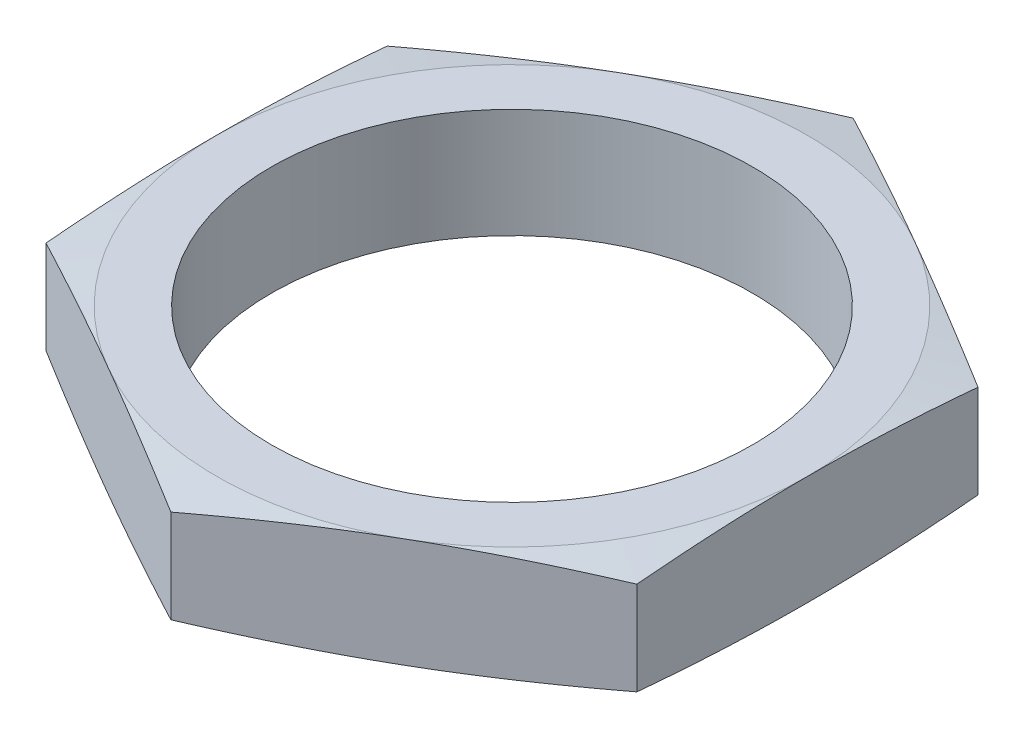
ISO-10303-21;
HEADER;
FILE_DESCRIPTION(('STEP AP214'),'2;1');
FILE_NAME('part.step','',(''),(''),'','','');
FILE_SCHEMA(('AUTOMOTIVE_DESIGN { 1 0 10303 214 1 1 1 1 }'));
ENDSEC;
DATA;
#1=APPLICATION_CONTEXT('core data for automotive mechanical design processes');
#2=APPLICATION_PROTOCOL_DEFINITION('international standard','automotive_design',2000,#1);
#3=PRODUCT_CONTEXT('',#1,'mechanical');
#4=PRODUCT('Part','Part','',(#3));
#5=PRODUCT_RELATED_PRODUCT_CATEGORY('part','',(#4));
#6=PRODUCT_DEFINITION_FORMATION('','',#4);
#7=PRODUCT_DEFINITION_CONTEXT('part definition',#1,'design');
#8=PRODUCT_DEFINITION('design','',#6,#7);
#9=PRODUCT_DEFINITION_SHAPE('','',#8);
#10=(LENGTH_UNIT() NAMED_UNIT(*) SI_UNIT(.MILLI.,.METRE.));
#11=(NAMED_UNIT(*) PLANE_ANGLE_UNIT() SI_UNIT($,.RADIAN.));
#12=(NAMED_UNIT(*) SI_UNIT($,.STERADIAN.) SOLID_ANGLE_UNIT());
#13=UNCERTAINTY_MEASURE_WITH_UNIT(LENGTH_MEASURE(1.E-05),#10,'distance_accuracy_value','');
#14=(GEOMETRIC_REPRESENTATION_CONTEXT(3) GLOBAL_UNCERTAINTY_ASSIGNED_CONTEXT((#13)) GLOBAL_UNIT_ASSIGNED_CONTEXT((#10,
#11,#12)) REPRESENTATION_CONTEXT('',''));
#15=CARTESIAN_POINT('',(0.,0.,0.));
#16=DIRECTION('',(0.,0.,1.));
#17=DIRECTION('',(1.,0.,0.));
#18=AXIS2_PLACEMENT_3D('',#15,#16,#17);
#19=CARTESIAN_POINT('',(13.5,5.,-7.79422863405995));
#20=DIRECTION('',(-0.5,0.,0.866025403784439));
#21=DIRECTION('',(0.866025403784439,0.,0.5));
#22=AXIS2_PLACEMENT_3D('',#19,#20,#21);
#23=PLANE('',#22);
#24=CARTESIAN_POINT('',(-0.00020000000000303,0.368271725138405,-15.5885727381737));
#25=CARTESIAN_POINT('',(0.561497951332436,0.31106498335108,-15.2642762747687));
#26=CARTESIAN_POINT('',(1.12364119894401,0.259202355278571,-14.939722719437));
#27=CARTESIAN_POINT('',(2.24878862374861,0.168169684781309,-14.2901185508481));
#28=CARTESIAN_POINT('',(2.81179293139074,0.129001807993039,-13.965067862276));
#29=CARTESIAN_POINT('',(3.93717630447165,0.0654553024233978,-13.3153274688862));
#30=CARTESIAN_POINT('',(4.49955393528797,0.0410436635396148,-12.9906385923481));
#31=CARTESIAN_POINT('',(5.62462106334258,0.00831666332102138,-12.3410807831094));
#32=CARTESIAN_POINT('',(6.18731053167129,0.,-12.0162118670997));
#33=CARTESIAN_POINT('',(7.3126894683287,0.,-11.3664740350802));
#34=CARTESIAN_POINT('',(7.87537893665741,0.00831666332102166,-11.0416051190704));
#35=CARTESIAN_POINT('',(9.00044606471202,0.041043663539615,-10.3920473098317));
#36=CARTESIAN_POINT('',(9.56282369552834,0.0654553024233979,-10.0673584332937));
#37=CARTESIAN_POINT('',(10.6882070686092,0.129001807993039,-9.41761803990388));
#38=CARTESIAN_POINT('',(11.2512113762514,0.168169684781309,-9.09256735133178));
#39=CARTESIAN_POINT('',(12.376358801056,0.259202355278571,-8.44296318274283));
#40=CARTESIAN_POINT('',(12.9385020486676,0.31106498335108,-8.11840962741116));
#41=CARTESIAN_POINT('',(13.5002,0.368271725138405,-7.79411316400611));
#42=B_SPLINE_CURVE_WITH_KNOTS('',3,(#24,#25,#26,#27,#28,#29,#30,#31,#32,#33,#34,#35,#36,#37,#38,
#39,#40,#41),.UNSPECIFIED.,.F.,.F.,(4,2,2,2,2,2,2,2,4),(0.,1.95337491286409,3.9070828827549,
5.85640402319247,7.80556746874311,9.75473091429375,11.7040520547313,13.6577600246221,
15.6111349374862),.UNSPECIFIED.);
#43=CARTESIAN_POINT('',(0.,0.368251364426223,-15.5884572681199));
#44=VERTEX_POINT('',#43);
#45=CARTESIAN_POINT('',(6.75,0.,-11.6913429510899));
#46=VERTEX_POINT('',#45);
#47=EDGE_CURVE('E55',#44,#46,#42,.T.);
#48=ORIENTED_EDGE('',*,*,#47,.F.);
#49=DIRECTION('',(0.,-1.,0.));
#50=VECTOR('',#49,1.);
#51=CARTESIAN_POINT('',(0.,5.,-15.5884572681199));
#52=LINE('',#51,#50);
#53=CARTESIAN_POINT('',(0.,4.63174863557378,-15.5884572681199));
#54=VERTEX_POINT('',#53);
#55=EDGE_CURVE('E281',#54,#44,#52,.T.);
#56=ORIENTED_EDGE('',*,*,#55,.F.);
#57=CARTESIAN_POINT('',(13.5002,4.6317282748616,-7.79411316400611));
#58=CARTESIAN_POINT('',(12.9385020486676,4.68893501664892,-8.11840962741116));
#59=CARTESIAN_POINT('',(12.376358801056,4.74079764472143,-8.44296318274283));
#60=CARTESIAN_POINT('',(11.2512113762514,4.83183031521869,-9.09256735133178));
#61=CARTESIAN_POINT('',(10.6882070686093,4.87099819200696,-9.41761803990388));
#62=CARTESIAN_POINT('',(9.56282369552834,4.9345446975766,-10.0673584332937));
#63=CARTESIAN_POINT('',(9.00044606471202,4.95895633646039,-10.3920473098317));
#64=CARTESIAN_POINT('',(7.87537893665742,4.99168333667898,-11.0416051190704));
#65=CARTESIAN_POINT('',(7.31268946832871,5.,-11.3664740350802));
#66=CARTESIAN_POINT('',(6.18731053167129,5.,-12.0162118670997));
#67=CARTESIAN_POINT('',(5.62462106334258,4.99168333667898,-12.3410807831094));
#68=CARTESIAN_POINT('',(4.49955393528797,4.95895633646039,-12.9906385923481));
#69=CARTESIAN_POINT('',(3.93717630447165,4.9345446975766,-13.3153274688862));
#70=CARTESIAN_POINT('',(2.81179293139074,4.87099819200696,-13.965067862276));
#71=CARTESIAN_POINT('',(2.24878862374861,4.83183031521869,-14.2901185508481));
#72=CARTESIAN_POINT('',(1.12364119894401,4.74079764472143,-14.939722719437));
#73=CARTESIAN_POINT('',(0.561497951332437,4.68893501664892,-15.2642762747687));
#74=CARTESIAN_POINT('',(-0.000200000000000708,4.6317282748616,-15.5885727381737));
#75=B_SPLINE_CURVE_WITH_KNOTS('',3,(#57,#58,#59,#60,#61,#62,#63,#64,#65,#66,#67,#68,#69,#70,#71,
#72,#73,#74),.UNSPECIFIED.,.F.,.F.,(4,2,2,2,2,2,2,2,4),(0.,1.95337491286409,3.9070828827549,
5.85640402319247,7.80556746874311,9.75473091429375,11.7040520547313,13.6577600246221,
15.6111349374862),.UNSPECIFIED.);
#76=CARTESIAN_POINT('',(6.75,5.,-11.6913429510899));
#77=VERTEX_POINT('',#76);
#78=EDGE_CURVE('E253',#77,#54,#75,.T.);
#79=ORIENTED_EDGE('',*,*,#78,.F.);
#80=CARTESIAN_POINT('',(13.5,4.63174863557382,-7.79422863405996));
#81=VERTEX_POINT('',#80);
#82=EDGE_CURVE('E321',#81,#77,#75,.T.);
#83=ORIENTED_EDGE('',*,*,#82,.F.);
#84=DIRECTION('',(0.,-1.,0.));
#85=VECTOR('',#84,1.);
#86=CARTESIAN_POINT('',(13.5,5.,-7.79422863405995));
#87=LINE('',#86,#85);
#88=CARTESIAN_POINT('',(13.5,0.368251364426223,-7.79422863405995));
#89=VERTEX_POINT('',#88);
#90=EDGE_CURVE('E323',#81,#89,#87,.T.);
#91=ORIENTED_EDGE('',*,*,#90,.T.);
#92=EDGE_CURVE('E140',#46,#89,#42,.T.);
#93=ORIENTED_EDGE('',*,*,#92,.F.);
#94=EDGE_LOOP('',(#48,#56,#79,#83,#91,#93));
#95=FACE_BOUND('',#94,.T.);
#96=ADVANCED_FACE('F39',(#95),#23,.F.);
#97=CARTESIAN_POINT('',(0.,5.,-15.5884572681199));
#98=DIRECTION('',(0.5,0.,0.866025403784439));
#99=DIRECTION('',(0.866025403784439,0.,-0.5));
#100=AXIS2_PLACEMENT_3D('',#97,#98,#99);
#101=PLANE('',#100);
#102=CARTESIAN_POINT('',(-13.5002,0.368271725138405,-7.79411316400611));
#103=CARTESIAN_POINT('',(-12.9385020486676,0.311064983351081,-8.11840962741115));
#104=CARTESIAN_POINT('',(-12.376358801056,0.259202355278572,-8.44296318274282));
#105=CARTESIAN_POINT('',(-11.2512113762514,0.168169684781309,-9.09256735133177));
#106=CARTESIAN_POINT('',(-10.6882070686093,0.12900180799304,-9.41761803990388));
#107=CARTESIAN_POINT('',(-9.56282369552835,0.0654553024233985,-10.0673584332937));
#108=CARTESIAN_POINT('',(-9.00044606471203,0.0410436635396154,-10.3920473098317));
#109=CARTESIAN_POINT('',(-7.87537893665742,0.00831666332102167,-11.0416051190704));
#110=CARTESIAN_POINT('',(-7.31268946832871,0.,-11.3664740350802));
#111=CARTESIAN_POINT('',(-6.18731053167129,0.,-12.0162118670997));
#112=CARTESIAN_POINT('',(-5.62462106334258,0.00831666332102172,-12.3410807831094));
#113=CARTESIAN_POINT('',(-4.49955393528798,0.0410436635396152,-12.9906385923481));
#114=CARTESIAN_POINT('',(-3.93717630447166,0.065455302423398,-13.3153274688862));
#115=CARTESIAN_POINT('',(-2.81179293139075,0.129001807993039,-13.965067862276));
#116=CARTESIAN_POINT('',(-2.24878862374861,0.168169684781309,-14.2901185508481));
#117=CARTESIAN_POINT('',(-1.12364119894401,0.259202355278571,-14.939722719437));
#118=CARTESIAN_POINT('',(-0.56149795133244,0.311064983351081,-15.2642762747687));
#119=CARTESIAN_POINT('',(0.000199999999997351,0.368271725138404,-15.5885727381737));
#120=B_SPLINE_CURVE_WITH_KNOTS('',3,(#102,#103,#104,#105,#106,#107,#108,#109,#110,#111,#112,
#113,#114,#115,#116,#117,#118,#119),.UNSPECIFIED.,.F.,.F.,(4,2,2,2,2,2,2,2,4),(0.,
1.95337491286409,3.9070828827549,5.85640402319247,7.80556746874311,9.75473091429376,
11.7040520547313,13.6577600246221,15.6111349374862),.UNSPECIFIED.);
#121=CARTESIAN_POINT('',(-13.5,0.368251364426224,-7.79422863405994));
#122=VERTEX_POINT('',#121);
#123=CARTESIAN_POINT('',(-6.75,0.,-11.6913429510899));
#124=VERTEX_POINT('',#123);
#125=EDGE_CURVE('E63',#122,#124,#120,.T.);
#126=ORIENTED_EDGE('',*,*,#125,.F.);
#127=DIRECTION('',(0.,-1.,0.));
#128=VECTOR('',#127,1.);
#129=CARTESIAN_POINT('',(-13.5,5.,-7.79422863405994));
#130=LINE('',#129,#128);
#131=CARTESIAN_POINT('',(-13.5,4.63174863557378,-7.79422863405994));
#132=VERTEX_POINT('',#131);
#133=EDGE_CURVE('E274',#132,#122,#130,.T.);
#134=ORIENTED_EDGE('',*,*,#133,.F.);
#135=CARTESIAN_POINT('',(0.000199999999996603,4.6317282748616,-15.5885727381737));
#136=CARTESIAN_POINT('',(-0.561497951332441,4.68893501664892,-15.2642762747687));
#137=CARTESIAN_POINT('',(-1.12364119894401,4.74079764472143,-14.939722719437));
#138=CARTESIAN_POINT('',(-2.24878862374861,4.83183031521869,-14.2901185508481));
#139=CARTESIAN_POINT('',(-2.81179293139075,4.87099819200696,-13.965067862276));
#140=CARTESIAN_POINT('',(-3.93717630447166,4.9345446975766,-13.3153274688862));
#141=CARTESIAN_POINT('',(-4.49955393528798,4.95895633646039,-12.9906385923481));
#142=CARTESIAN_POINT('',(-5.62462106334258,4.99168333667898,-12.3410807831094));
#143=CARTESIAN_POINT('',(-6.18731053167129,5.,-12.0162118670997));
#144=CARTESIAN_POINT('',(-7.31268946832871,5.,-11.3664740350802));
#145=CARTESIAN_POINT('',(-7.87537893665742,4.99168333667898,-11.0416051190704));
#146=CARTESIAN_POINT('',(-9.00044606471203,4.95895633646038,-10.3920473098317));
#147=CARTESIAN_POINT('',(-9.56282369552835,4.9345446975766,-10.0673584332937));
#148=CARTESIAN_POINT('',(-10.6882070686093,4.87099819200696,-9.41761803990388));
#149=CARTESIAN_POINT('',(-11.2512113762514,4.83183031521869,-9.09256735133177));
#150=CARTESIAN_POINT('',(-12.376358801056,4.74079764472143,-8.44296318274282));
#151=CARTESIAN_POINT('',(-12.9385020486676,4.68893501664892,-8.11840962741115));
#152=CARTESIAN_POINT('',(-13.5002,4.63172827486159,-7.79411316400611));
#153=B_SPLINE_CURVE_WITH_KNOTS('',3,(#135,#136,#137,#138,#139,#140,#141,#142,#143,#144,#145,
#146,#147,#148,#149,#150,#151,#152),.UNSPECIFIED.,.F.,.F.,(4,2,2,2,2,2,2,2,4),(0.,
1.95337491286409,3.9070828827549,5.85640402319247,7.80556746874311,9.75473091429376,
11.7040520547313,13.6577600246221,15.6111349374862),.UNSPECIFIED.);
#154=CARTESIAN_POINT('',(-6.75,5.,-11.6913429510899));
#155=VERTEX_POINT('',#154);
#156=EDGE_CURVE('E246',#155,#132,#153,.T.);
#157=ORIENTED_EDGE('',*,*,#156,.F.);
#158=EDGE_CURVE('E252',#54,#155,#153,.T.);
#159=ORIENTED_EDGE('',*,*,#158,.F.);
#160=ORIENTED_EDGE('',*,*,#55,.T.);
#161=EDGE_CURVE('E163',#124,#44,#120,.T.);
#162=ORIENTED_EDGE('',*,*,#161,.F.);
#163=EDGE_LOOP('',(#126,#134,#157,#159,#160,#162));
#164=FACE_BOUND('',#163,.T.);
#165=ADVANCED_FACE('F259',(#164),#101,.F.);
#166=CARTESIAN_POINT('',(-13.5,5.,-7.79422863405994));
#167=DIRECTION('',(1.,0.,0.));
#168=DIRECTION('',(0.,0.,-1.));
#169=AXIS2_PLACEMENT_3D('',#166,#167,#168);
#170=PLANE('',#169);
#171=CARTESIAN_POINT('',(-13.5,2.50038445985799,24.1651341778048));
#172=CARTESIAN_POINT('',(-13.5,2.41133438586779,23.5865655697409));
#173=CARTESIAN_POINT('',(-13.5,2.3230055622341,23.0078848992821));
#174=CARTESIAN_POINT('',(-13.5,2.14811279405614,21.8502530795387));
#175=CARTESIAN_POINT('',(-13.5,2.06154886147534,21.2713019284477));
#176=CARTESIAN_POINT('',(-13.5,1.89050294751876,20.1130464697946));
#177=CARTESIAN_POINT('',(-13.5,1.80602112541964,19.5337421386672));
#178=CARTESIAN_POINT('',(-13.5,1.6395670803526,18.3747732059946));
#179=CARTESIAN_POINT('',(-13.5,1.55759485394562,17.7951086049442));
#180=CARTESIAN_POINT('',(-13.5,1.39633127331956,16.6328657618726));
#181=CARTESIAN_POINT('',(-13.5,1.31705295770941,16.0502857062533));
#182=CARTESIAN_POINT('',(-13.5,1.1622023727252,14.884633606531));
#183=CARTESIAN_POINT('',(-13.5,1.08663009151501,14.3015615640053));
#184=CARTESIAN_POINT('',(-13.5,0.93999668772585,13.1348203987256));
#185=CARTESIAN_POINT('',(-13.5,0.868935777041812,12.5511512492324));
#186=CARTESIAN_POINT('',(-13.5,0.732321153654732,11.3831651415254));
#187=CARTESIAN_POINT('',(-13.5,0.666767442345757,10.7988481831476));
#188=CARTESIAN_POINT('',(-13.5,0.543127517647167,9.63670252981086));
#189=CARTESIAN_POINT('',(-13.5,0.484959227429369,9.05888262518919));
#190=CARTESIAN_POINT('',(-13.5,0.376495408899913,7.90249784506874));
#191=CARTESIAN_POINT('',(-13.5,0.326199881744173,7.32393296946059));
#192=CARTESIAN_POINT('',(-13.5,0.234955033257652,6.16611352907483));
#193=CARTESIAN_POINT('',(-13.5,0.194004831218052,5.58685903446343));
#194=CARTESIAN_POINT('',(-13.5,0.122928088159684,4.42768852092813));
#195=CARTESIAN_POINT('',(-13.5,0.0928013420662188,3.84777251474693));
#196=CARTESIAN_POINT('',(-13.5,0.0447201045273418,2.68859630675632));
#197=CARTESIAN_POINT('',(-13.5,0.0267412611132666,2.10933713073504));
#198=CARTESIAN_POINT('',(-13.5,0.0037342245965768,0.950559213292028));
#199=CARTESIAN_POINT('',(-13.5,-0.00129400632683923,0.371040472633274));
#200=CARTESIAN_POINT('',(-13.5,0.00186158062303646,-0.787969178032957));
#201=CARTESIAN_POINT('',(-13.5,0.0100455751775713,-1.36746008756463));
#202=CARTESIAN_POINT('',(-13.5,0.03920152457032,-2.52611038678154));
#203=CARTESIAN_POINT('',(-13.5,0.0601734698502246,-3.10526977671425));
#204=CARTESIAN_POINT('',(-13.5,0.126709878266207,-4.53845207825201));
#205=CARTESIAN_POINT('',(-13.5,0.179227472813653,-5.39215606171026));
#206=CARTESIAN_POINT('',(-13.5,0.273925890405902,-6.67147495268846));
#207=CARTESIAN_POINT('',(-13.5,0.308145934757269,-7.09771076535912));
#208=CARTESIAN_POINT('',(-13.5,0.381289636143853,-7.94978321081655));
#209=CARTESIAN_POINT('',(-13.5,0.420213321354817,-8.37561984119674));
#210=CARTESIAN_POINT('',(-13.5,0.543290220919931,-9.65379321222884));
#211=CARTESIAN_POINT('',(-13.5,0.633652448379785,-10.5055319576611));
#212=CARTESIAN_POINT('',(-13.5,0.826853419761355,-12.207589396941));
#213=CARTESIAN_POINT('',(-13.5,0.929692475003411,-13.057908054818));
#214=CARTESIAN_POINT('',(-13.5,1.14572867739266,-14.7653925271363));
#215=CARTESIAN_POINT('',(-13.5,1.25901459330296,-15.622547036385));
#216=CARTESIAN_POINT('',(-13.5,1.49271698185962,-17.3358820806901));
#217=CARTESIAN_POINT('',(-13.5,1.61313349567426,-18.1920626100942));
#218=CARTESIAN_POINT('',(-13.5,1.85904200199402,-19.9014213847991));
#219=CARTESIAN_POINT('',(-13.5,1.98451999482958,-20.7546016509483));
#220=CARTESIAN_POINT('',(-13.5,2.17582745764312,-22.0338934678126));
#221=CARTESIAN_POINT('',(-13.5,2.24011061514708,-22.4602373467724));
#222=CARTESIAN_POINT('',(-13.5,2.36959107074118,-23.3127859974156));
#223=CARTESIAN_POINT('',(-13.5,2.43478836817076,-23.7389907691993));
#224=CARTESIAN_POINT('',(-13.5,2.50038445985799,-24.1651341778048));
#225=B_SPLINE_CURVE_WITH_KNOTS('',3,(#171,#172,#173,#174,#175,#176,#177,#178,#179,#180,#181,
#182,#183,#184,#185,#186,#187,#188,#189,#190,#191,#192,#193,#194,#195,#196,#197,#198,#199,#200,
#201,#202,#203,#204,#205,#206,#207,#208,#209,#210,#211,#212,#213,#214,#215,#216,#217,#218,#219,
#220,#221,#222,#223,#224),.UNSPECIFIED.,.F.,.F.,(4,2,2,2,2,2,2,2,2,2,2,2,2,2,2,2,2,2,2,2,2,2,2,
2,2,2,4),(0.,1.75614572345634,3.51230334713401,5.26859489843896,7.02488404288146,
8.78872273659729,10.5525557966891,12.316471641199,14.0803879322174,15.8225645898386,
17.5647415032546,19.3067541650531,21.0487338187659,22.7872110162111,24.5256831366241,
26.2641785050478,28.0026725740409,30.5682516362685,31.8510554118297,33.1338668720227,
35.7032846095398,38.272766472057,40.8665508820554,43.4603502686402,46.0474105949257,
47.3408984852324,48.6343854408956),.UNSPECIFIED.);
#226=CARTESIAN_POINT('',(-13.5,0.368251364426224,7.79422863405995));
#227=VERTEX_POINT('',#226);
#228=CARTESIAN_POINT('',(-13.5,0.,0.));
#229=VERTEX_POINT('',#228);
#230=EDGE_CURVE('E350',#227,#229,#225,.T.);
#231=ORIENTED_EDGE('',*,*,#230,.F.);
#232=DIRECTION('',(0.,-1.,0.));
#233=VECTOR('',#232,1.);
#234=CARTESIAN_POINT('',(-13.5,5.,7.79422863405995));
#235=LINE('',#234,#233);
#236=CARTESIAN_POINT('',(-13.5,4.63174863557378,7.79422863405995));
#237=VERTEX_POINT('',#236);
#238=EDGE_CURVE('E282',#237,#227,#235,.T.);
#239=ORIENTED_EDGE('',*,*,#238,.F.);
#240=CARTESIAN_POINT('',(-13.5,2.49961554014201,-24.1651341778048));
#241=CARTESIAN_POINT('',(-13.5,2.58866561413221,-23.5865655697409));
#242=CARTESIAN_POINT('',(-13.5,2.6769944377659,-23.0078848992821));
#243=CARTESIAN_POINT('',(-13.5,2.85188720594386,-21.8502530795387));
#244=CARTESIAN_POINT('',(-13.5,2.93845113852466,-21.2713019284477));
#245=CARTESIAN_POINT('',(-13.5,3.10949705248124,-20.1130464697946));
#246=CARTESIAN_POINT('',(-13.5,3.19397887458036,-19.5337421386672));
#247=CARTESIAN_POINT('',(-13.5,3.3604329196474,-18.3747732059946));
#248=CARTESIAN_POINT('',(-13.5,3.44240514605438,-17.7951086049442));
#249=CARTESIAN_POINT('',(-13.5,3.60366872668044,-16.6328657618726));
#250=CARTESIAN_POINT('',(-13.5,3.68294704229059,-16.0502857062533));
#251=CARTESIAN_POINT('',(-13.5,3.8377976272748,-14.884633606531));
#252=CARTESIAN_POINT('',(-13.5,3.91336990848499,-14.3015615640052));
#253=CARTESIAN_POINT('',(-13.5,4.06000331227415,-13.1348203987256));
#254=CARTESIAN_POINT('',(-13.5,4.13106422295819,-12.5511512492324));
#255=CARTESIAN_POINT('',(-13.5,4.26767884634527,-11.3831651415254));
#256=CARTESIAN_POINT('',(-13.5,4.33323255765424,-10.7988481831476));
#257=CARTESIAN_POINT('',(-13.5,4.45687248235283,-9.63670252981086));
#258=CARTESIAN_POINT('',(-13.5,4.51504077257063,-9.05888262518918));
#259=CARTESIAN_POINT('',(-13.5,4.62350459110009,-7.90249784506873));
#260=CARTESIAN_POINT('',(-13.5,4.67380011825583,-7.32393296946058));
#261=CARTESIAN_POINT('',(-13.5,4.76504496674235,-6.16611352907482));
#262=CARTESIAN_POINT('',(-13.5,4.80599516878195,-5.58685903446342));
#263=CARTESIAN_POINT('',(-13.5,4.87707191184032,-4.42768852092812));
#264=CARTESIAN_POINT('',(-13.5,4.90719865793378,-3.84777251474692));
#265=CARTESIAN_POINT('',(-13.5,4.95527989547266,-2.68859630675632));
#266=CARTESIAN_POINT('',(-13.5,4.97325873888673,-2.10933713073503));
#267=CARTESIAN_POINT('',(-13.5,4.99626577540342,-0.950559213292021));
#268=CARTESIAN_POINT('',(-13.5,5.00129400632684,-0.371040472633267));
#269=CARTESIAN_POINT('',(-13.5,4.99813841937696,0.787969178032964));
#270=CARTESIAN_POINT('',(-13.5,4.98995442482243,1.36746008756464));
#271=CARTESIAN_POINT('',(-13.5,4.96079847542968,2.52611038678155));
#272=CARTESIAN_POINT('',(-13.5,4.93982653014977,3.10526977671425));
#273=CARTESIAN_POINT('',(-13.5,4.87329012173379,4.53845207825201));
#274=CARTESIAN_POINT('',(-13.5,4.82077252718635,5.39215606171027));
#275=CARTESIAN_POINT('',(-13.5,4.7260741095941,6.67147495268847));
#276=CARTESIAN_POINT('',(-13.5,4.69185406524273,7.09771076535913));
#277=CARTESIAN_POINT('',(-13.5,4.61871036385615,7.94978321081656));
#278=CARTESIAN_POINT('',(-13.5,4.57978667864518,8.37561984119675));
#279=CARTESIAN_POINT('',(-13.5,4.45670977908007,9.65379321222885));
#280=CARTESIAN_POINT('',(-13.5,4.36634755162021,10.5055319576611));
#281=CARTESIAN_POINT('',(-13.5,4.17314658023865,12.207589396941));
#282=CARTESIAN_POINT('',(-13.5,4.07030752499659,13.057908054818));
#283=CARTESIAN_POINT('',(-13.5,3.85427132260734,14.7653925271363));
#284=CARTESIAN_POINT('',(-13.5,3.74098540669704,15.622547036385));
#285=CARTESIAN_POINT('',(-13.5,3.50728301814038,17.3358820806901));
#286=CARTESIAN_POINT('',(-13.5,3.38686650432574,18.1920626100942));
#287=CARTESIAN_POINT('',(-13.5,3.14095799800598,19.9014213847991));
#288=CARTESIAN_POINT('',(-13.5,3.01548000517042,20.7546016509483));
#289=CARTESIAN_POINT('',(-13.5,2.82417254235688,22.0338934678126));
#290=CARTESIAN_POINT('',(-13.5,2.75988938485292,22.4602373467724));
#291=CARTESIAN_POINT('',(-13.5,2.63040892925882,23.3127859974156));
#292=CARTESIAN_POINT('',(-13.5,2.56521163182924,23.7389907691993));
#293=CARTESIAN_POINT('',(-13.5,2.49961554014201,24.1651341778048));
#294=B_SPLINE_CURVE_WITH_KNOTS('',3,(#240,#241,#242,#243,#244,#245,#246,#247,#248,#249,#250,
#251,#252,#253,#254,#255,#256,#257,#258,#259,#260,#261,#262,#263,#264,#265,#266,#267,#268,#269,
#270,#271,#272,#273,#274,#275,#276,#277,#278,#279,#280,#281,#282,#283,#284,#285,#286,#287,#288,
#289,#290,#291,#292,#293),.UNSPECIFIED.,.F.,.F.,(4,2,2,2,2,2,2,2,2,2,2,2,2,2,2,2,2,2,2,2,2,2,2,
2,2,2,4),(0.,1.75614572345634,3.51230334713401,5.26859489843896,7.02488404288146,
8.78872273659729,10.5525557966891,12.316471641199,14.0803879322174,15.8225645898386,
17.5647415032546,19.3067541650531,21.0487338187659,22.7872110162111,24.5256831366241,
26.2641785050478,28.0026725740409,30.5682516362685,31.8510554118297,33.1338668720226,
35.7032846095398,38.272766472057,40.8665508820553,43.4603502686402,46.0474105949257,
47.3408984852324,48.6343854408956),.UNSPECIFIED.);
#295=CARTESIAN_POINT('',(-13.5,5.,0.));
#296=VERTEX_POINT('',#295);
#297=EDGE_CURVE('E239',#296,#237,#294,.T.);
#298=ORIENTED_EDGE('',*,*,#297,.F.);
#299=EDGE_CURVE('E245',#132,#296,#294,.T.);
#300=ORIENTED_EDGE('',*,*,#299,.F.);
#301=ORIENTED_EDGE('',*,*,#133,.T.);
#302=EDGE_CURVE('E198',#229,#122,#225,.T.);
#303=ORIENTED_EDGE('',*,*,#302,.F.);
#304=EDGE_LOOP('',(#231,#239,#298,#300,#301,#303));
#305=FACE_BOUND('',#304,.T.);
#306=ADVANCED_FACE('F220',(#305),#170,.F.);
#307=CARTESIAN_POINT('',(-13.5,5.,7.79422863405995));
#308=DIRECTION('',(0.5,0.,-0.866025403784439));
#309=DIRECTION('',(-0.866025403784439,0.,-0.5));
#310=AXIS2_PLACEMENT_3D('',#307,#308,#309);
#311=PLANE('',#310);
#312=CARTESIAN_POINT('',(0.000200000000003819,0.368271725138405,15.5885727381737));
#313=CARTESIAN_POINT('',(-0.561497951332435,0.311064983351081,15.2642762747687));
#314=CARTESIAN_POINT('',(-1.12364119894401,0.259202355278572,14.939722719437));
#315=CARTESIAN_POINT('',(-2.2487886237486,0.168169684781309,14.2901185508481));
#316=CARTESIAN_POINT('',(-2.81179293139074,0.12900180799304,13.965067862276));
#317=CARTESIAN_POINT('',(-3.93717630447165,0.0654553024233984,13.3153274688862));
#318=CARTESIAN_POINT('',(-4.49955393528797,0.0410436635396153,12.9906385923481));
#319=CARTESIAN_POINT('',(-5.62462106334258,0.00831666332102175,12.3410807831094));
#320=CARTESIAN_POINT('',(-6.18731053167129,0.,12.0162118670997));
#321=CARTESIAN_POINT('',(-7.31268946832871,0.,11.3664740350802));
#322=CARTESIAN_POINT('',(-7.87537893665742,0.00831666332102183,11.0416051190704));
#323=CARTESIAN_POINT('',(-9.00044606471202,0.0410436635396154,10.3920473098317));
#324=CARTESIAN_POINT('',(-9.56282369552834,0.0654553024233983,10.0673584332937));
#325=CARTESIAN_POINT('',(-10.6882070686093,0.12900180799304,9.41761803990388));
#326=CARTESIAN_POINT('',(-11.2512113762514,0.168169684781309,9.09256735133178));
#327=CARTESIAN_POINT('',(-12.376358801056,0.259202355278572,8.44296318274283));
#328=CARTESIAN_POINT('',(-12.9385020486676,0.311064983351081,8.11840962741116));
#329=CARTESIAN_POINT('',(-13.5002,0.368271725138405,7.79411316400611));
#330=B_SPLINE_CURVE_WITH_KNOTS('',3,(#312,#313,#314,#315,#316,#317,#318,#319,#320,#321,#322,
#323,#324,#325,#326,#327,#328,#329),.UNSPECIFIED.,.F.,.F.,(4,2,2,2,2,2,2,2,4),(0.,
1.95337491286409,3.9070828827549,5.85640402319247,7.80556746874311,9.75473091429376,
11.7040520547313,13.6577600246221,15.6111349374862),.UNSPECIFIED.);
#331=CARTESIAN_POINT('',(0.,0.368251364426224,15.5884572681199));
#332=VERTEX_POINT('',#331);
#333=CARTESIAN_POINT('',(-6.75,0.,11.6913429510899));
#334=VERTEX_POINT('',#333);
#335=EDGE_CURVE('E149',#332,#334,#330,.T.);
#336=ORIENTED_EDGE('',*,*,#335,.F.);
#337=DIRECTION('',(0.,-1.,0.));
#338=VECTOR('',#337,1.);
#339=CARTESIAN_POINT('',(0.,5.,15.5884572681199));
#340=LINE('',#339,#338);
#341=CARTESIAN_POINT('',(0.,4.63174863557378,15.5884572681199));
#342=VERTEX_POINT('',#341);
#343=EDGE_CURVE('E162',#342,#332,#340,.T.);
#344=ORIENTED_EDGE('',*,*,#343,.F.);
#345=CARTESIAN_POINT('',(-13.5002,4.6317282748616,7.79411316400611));
#346=CARTESIAN_POINT('',(-12.9385020486676,4.68893501664892,8.11840962741116));
#347=CARTESIAN_POINT('',(-12.376358801056,4.74079764472143,8.44296318274283));
#348=CARTESIAN_POINT('',(-11.2512113762514,4.83183031521869,9.09256735133178));
#349=CARTESIAN_POINT('',(-10.6882070686093,4.87099819200696,9.41761803990388));
#350=CARTESIAN_POINT('',(-9.56282369552834,4.9345446975766,10.0673584332937));
#351=CARTESIAN_POINT('',(-9.00044606471202,4.95895633646038,10.3920473098317));
#352=CARTESIAN_POINT('',(-7.87537893665742,4.99168333667898,11.0416051190704));
#353=CARTESIAN_POINT('',(-7.31268946832871,5.,11.3664740350802));
#354=CARTESIAN_POINT('',(-6.18731053167129,5.,12.0162118670997));
#355=CARTESIAN_POINT('',(-5.62462106334258,4.99168333667898,12.3410807831094));
#356=CARTESIAN_POINT('',(-4.49955393528797,4.95895633646038,12.9906385923481));
#357=CARTESIAN_POINT('',(-3.93717630447165,4.9345446975766,13.3153274688862));
#358=CARTESIAN_POINT('',(-2.81179293139074,4.87099819200696,13.965067862276));
#359=CARTESIAN_POINT('',(-2.2487886237486,4.83183031521869,14.2901185508481));
#360=CARTESIAN_POINT('',(-1.12364119894401,4.74079764472143,14.939722719437));
#361=CARTESIAN_POINT('',(-0.561497951332435,4.68893501664892,15.2642762747687));
#362=CARTESIAN_POINT('',(0.000200000000003942,4.63172827486159,15.5885727381737));
#363=B_SPLINE_CURVE_WITH_KNOTS('',3,(#345,#346,#347,#348,#349,#350,#351,#352,#353,#354,#355,
#356,#357,#358,#359,#360,#361,#362),.UNSPECIFIED.,.F.,.F.,(4,2,2,2,2,2,2,2,4),(0.,
1.95337491286409,3.9070828827549,5.85640402319247,7.80556746874311,9.75473091429376,
11.7040520547313,13.6577600246221,15.6111349374862),.UNSPECIFIED.);
#364=CARTESIAN_POINT('',(-6.75,5.,11.6913429510899));
#365=VERTEX_POINT('',#364);
#366=EDGE_CURVE('E225',#365,#342,#363,.T.);
#367=ORIENTED_EDGE('',*,*,#366,.F.);
#368=EDGE_CURVE('E232',#237,#365,#363,.T.);
#369=ORIENTED_EDGE('',*,*,#368,.F.);
#370=ORIENTED_EDGE('',*,*,#238,.T.);
#371=EDGE_CURVE('E165',#334,#227,#330,.T.);
#372=ORIENTED_EDGE('',*,*,#371,.F.);
#373=EDGE_LOOP('',(#336,#344,#367,#369,#370,#372));
#374=FACE_BOUND('',#373,.T.);
#375=ADVANCED_FACE('F217',(#374),#311,.F.);
#376=CARTESIAN_POINT('',(0.,5.,15.5884572681199));
#377=DIRECTION('',(-0.5,0.,-0.866025403784439));
#378=DIRECTION('',(-0.866025403784439,0.,0.5));
#379=AXIS2_PLACEMENT_3D('',#376,#377,#378);
#380=PLANE('',#379);
#381=CARTESIAN_POINT('',(13.5002,0.368271725138406,7.79411316400611));
#382=CARTESIAN_POINT('',(12.9385020486676,0.311064983351081,8.11840962741115));
#383=CARTESIAN_POINT('',(12.376358801056,0.259202355278572,8.44296318274283));
#384=CARTESIAN_POINT('',(11.2512113762514,0.16816968478131,9.09256735133177));
#385=CARTESIAN_POINT('',(10.6882070686093,0.12900180799304,9.41761803990388));
#386=CARTESIAN_POINT('',(9.56282369552835,0.0654553024233988,10.0673584332937));
#387=CARTESIAN_POINT('',(9.00044606471203,0.0410436635396158,10.3920473098317));
#388=CARTESIAN_POINT('',(7.87537893665742,0.00831666332102219,11.0416051190704));
#389=CARTESIAN_POINT('',(7.31268946832871,0.,11.3664740350802));
#390=CARTESIAN_POINT('',(6.18731053167129,0.,12.0162118670997));
#391=CARTESIAN_POINT('',(5.62462106334258,0.0083166633210219,12.3410807831094));
#392=CARTESIAN_POINT('',(4.49955393528798,0.0410436635396155,12.9906385923481));
#393=CARTESIAN_POINT('',(3.93717630447166,0.0654553024233985,13.3153274688862));
#394=CARTESIAN_POINT('',(2.81179293139075,0.12900180799304,13.965067862276));
#395=CARTESIAN_POINT('',(2.24878862374861,0.16816968478131,14.2901185508481));
#396=CARTESIAN_POINT('',(1.12364119894401,0.259202355278572,14.939722719437));
#397=CARTESIAN_POINT('',(0.56149795133244,0.311064983351081,15.2642762747687));
#398=CARTESIAN_POINT('',(-0.000199999999997402,0.368271725138405,15.5885727381737));
#399=B_SPLINE_CURVE_WITH_KNOTS('',3,(#381,#382,#383,#384,#385,#386,#387,#388,#389,#390,#391,
#392,#393,#394,#395,#396,#397,#398),.UNSPECIFIED.,.F.,.F.,(4,2,2,2,2,2,2,2,4),(0.,
1.95337491286409,3.9070828827549,5.85640402319247,7.80556746874311,9.75473091429376,
11.7040520547313,13.6577600246221,15.6111349374862),.UNSPECIFIED.);
#400=CARTESIAN_POINT('',(13.5,0.368251364426182,7.79422863405996));
#401=VERTEX_POINT('',#400);
#402=CARTESIAN_POINT('',(6.75,0.,11.6913429510899));
#403=VERTEX_POINT('',#402);
#404=EDGE_CURVE('E129',#401,#403,#399,.T.);
#405=ORIENTED_EDGE('',*,*,#404,.F.);
#406=DIRECTION('',(0.,-1.,0.));
#407=VECTOR('',#406,1.);
#408=CARTESIAN_POINT('',(13.5,5.,7.79422863405995));
#409=LINE('',#408,#407);
#410=CARTESIAN_POINT('',(13.5,4.63174863557378,7.79422863405995));
#411=VERTEX_POINT('',#410);
#412=EDGE_CURVE('E328',#411,#401,#409,.T.);
#413=ORIENTED_EDGE('',*,*,#412,.F.);
#414=CARTESIAN_POINT('',(-0.000199999999996635,4.6317282748616,15.5885727381737));
#415=CARTESIAN_POINT('',(0.561497951332442,4.68893501664892,15.2642762747687));
#416=CARTESIAN_POINT('',(1.12364119894401,4.74079764472143,14.939722719437));
#417=CARTESIAN_POINT('',(2.24878862374861,4.83183031521869,14.2901185508481));
#418=CARTESIAN_POINT('',(2.81179293139075,4.87099819200696,13.965067862276));
#419=CARTESIAN_POINT('',(3.93717630447166,4.9345446975766,13.3153274688862));
#420=CARTESIAN_POINT('',(4.49955393528798,4.95895633646038,12.9906385923481));
#421=CARTESIAN_POINT('',(5.62462106334258,4.99168333667898,12.3410807831094));
#422=CARTESIAN_POINT('',(6.18731053167129,5.,12.0162118670997));
#423=CARTESIAN_POINT('',(7.31268946832871,5.,11.3664740350802));
#424=CARTESIAN_POINT('',(7.87537893665742,4.99168333667898,11.0416051190704));
#425=CARTESIAN_POINT('',(9.00044606471203,4.95895633646038,10.3920473098317));
#426=CARTESIAN_POINT('',(9.56282369552835,4.9345446975766,10.0673584332937));
#427=CARTESIAN_POINT('',(10.6882070686093,4.87099819200696,9.41761803990388));
#428=CARTESIAN_POINT('',(11.2512113762514,4.83183031521869,9.09256735133177));
#429=CARTESIAN_POINT('',(12.376358801056,4.74079764472143,8.44296318274283));
#430=CARTESIAN_POINT('',(12.9385020486676,4.68893501664892,8.11840962741115));
#431=CARTESIAN_POINT('',(13.5002,4.63172827486159,7.79411316400611));
#432=B_SPLINE_CURVE_WITH_KNOTS('',3,(#414,#415,#416,#417,#418,#419,#420,#421,#422,#423,#424,
#425,#426,#427,#428,#429,#430,#431),.UNSPECIFIED.,.F.,.F.,(4,2,2,2,2,2,2,2,4),(0.,
1.95337491286409,3.9070828827549,5.85640402319247,7.80556746874311,9.75473091429376,
11.7040520547313,13.6577600246221,15.6111349374862),.UNSPECIFIED.);
#433=CARTESIAN_POINT('',(6.75,5.,11.6913429510899));
#434=VERTEX_POINT('',#433);
#435=EDGE_CURVE('E234',#434,#411,#432,.T.);
#436=ORIENTED_EDGE('',*,*,#435,.F.);
#437=EDGE_CURVE('E233',#342,#434,#432,.T.);
#438=ORIENTED_EDGE('',*,*,#437,.F.);
#439=ORIENTED_EDGE('',*,*,#343,.T.);
#440=EDGE_CURVE('E143',#403,#332,#399,.T.);
#441=ORIENTED_EDGE('',*,*,#440,.F.);
#442=EDGE_LOOP('',(#405,#413,#436,#438,#439,#441));
#443=FACE_BOUND('',#442,.T.);
#444=ADVANCED_FACE('F159',(#443),#380,.F.);
#445=CARTESIAN_POINT('',(13.5,5.,7.79422863405995));
#446=DIRECTION('',(-1.,0.,0.));
#447=DIRECTION('',(0.,0.,1.));
#448=AXIS2_PLACEMENT_3D('',#445,#446,#447);
#449=PLANE('',#448);
#450=CARTESIAN_POINT('',(13.5,2.50038445985799,-24.1651341778049));
#451=CARTESIAN_POINT('',(13.5,2.41133438586779,-23.5865655697409));
#452=CARTESIAN_POINT('',(13.5,2.3230055622341,-23.0078848992821));
#453=CARTESIAN_POINT('',(13.5,2.14811279405614,-21.8502530795387));
#454=CARTESIAN_POINT('',(13.5,2.06154886147534,-21.2713019284477));
#455=CARTESIAN_POINT('',(13.5,1.89050294751876,-20.1130464697946));
#456=CARTESIAN_POINT('',(13.5,1.80602112541964,-19.5337421386672));
#457=CARTESIAN_POINT('',(13.5,1.6395670803526,-18.3747732059946));
#458=CARTESIAN_POINT('',(13.5,1.55759485394562,-17.7951086049442));
#459=CARTESIAN_POINT('',(13.5,1.39633127331956,-16.6328657618726));
#460=CARTESIAN_POINT('',(13.5,1.31705295770941,-16.0502857062533));
#461=CARTESIAN_POINT('',(13.5,1.1622023727252,-14.884633606531));
#462=CARTESIAN_POINT('',(13.5,1.08663009151501,-14.3015615640053));
#463=CARTESIAN_POINT('',(13.5,0.939996687725851,-13.1348203987256));
#464=CARTESIAN_POINT('',(13.5,0.868935777041813,-12.5511512492324));
#465=CARTESIAN_POINT('',(13.5,0.732321153654732,-11.3831651415254));
#466=CARTESIAN_POINT('',(13.5,0.666767442345757,-10.7988481831476));
#467=CARTESIAN_POINT('',(13.5,0.543127517647167,-9.63670252981086));
#468=CARTESIAN_POINT('',(13.5,0.484959227429369,-9.05888262518919));
#469=CARTESIAN_POINT('',(13.5,0.376495408899913,-7.90249784506874));
#470=CARTESIAN_POINT('',(13.5,0.326199881744173,-7.32393296946059));
#471=CARTESIAN_POINT('',(13.5,0.234955033257651,-6.16611352907483));
#472=CARTESIAN_POINT('',(13.5,0.194004831218052,-5.58685903446343));
#473=CARTESIAN_POINT('',(13.5,0.122928088159683,-4.42768852092813));
#474=CARTESIAN_POINT('',(13.5,0.0928013420662181,-3.84777251474693));
#475=CARTESIAN_POINT('',(13.5,0.0447201045273415,-2.68859630675633));
#476=CARTESIAN_POINT('',(13.5,0.0267412611132666,-2.10933713073504));
#477=CARTESIAN_POINT('',(13.5,0.00373422459657699,-0.950559213292029));
#478=CARTESIAN_POINT('',(13.5,-0.0012940063268393,-0.371040472633274));
#479=CARTESIAN_POINT('',(13.5,0.00186158062303624,0.787969178032957));
#480=CARTESIAN_POINT('',(13.5,0.0100455751775712,1.36746008756463));
#481=CARTESIAN_POINT('',(13.5,0.0392015245703199,2.52611038678154));
#482=CARTESIAN_POINT('',(13.5,0.0601734698502245,3.10526977671425));
#483=CARTESIAN_POINT('',(13.5,0.126709878266207,4.53845207825201));
#484=CARTESIAN_POINT('',(13.5,0.179227472813653,5.39215606171026));
#485=CARTESIAN_POINT('',(13.5,0.273925890405902,6.67147495268847));
#486=CARTESIAN_POINT('',(13.5,0.30814593475727,7.09771076535913));
#487=CARTESIAN_POINT('',(13.5,0.381289636143853,7.94978321081655));
#488=CARTESIAN_POINT('',(13.5,0.420213321354817,8.37561984119674));
#489=CARTESIAN_POINT('',(13.5,0.543290220919932,9.65379321222885));
#490=CARTESIAN_POINT('',(13.5,0.633652448379786,10.5055319576611));
#491=CARTESIAN_POINT('',(13.5,0.826853419761355,12.207589396941));
#492=CARTESIAN_POINT('',(13.5,0.929692475003412,13.057908054818));
#493=CARTESIAN_POINT('',(13.5,1.14572867739266,14.7653925271363));
#494=CARTESIAN_POINT('',(13.5,1.25901459330296,15.622547036385));
#495=CARTESIAN_POINT('',(13.5,1.49271698185962,17.3358820806901));
#496=CARTESIAN_POINT('',(13.5,1.61313349567426,18.1920626100942));
#497=CARTESIAN_POINT('',(13.5,1.85904200199402,19.9014213847991));
#498=CARTESIAN_POINT('',(13.5,1.98451999482958,20.7546016509483));
#499=CARTESIAN_POINT('',(13.5,2.17582745764312,22.0338934678126));
#500=CARTESIAN_POINT('',(13.5,2.24011061514708,22.4602373467724));
#501=CARTESIAN_POINT('',(13.5,2.36959107074119,23.3127859974156));
#502=CARTESIAN_POINT('',(13.5,2.43478836817076,23.7389907691993));
#503=CARTESIAN_POINT('',(13.5,2.50038445985799,24.1651341778048));
#504=B_SPLINE_CURVE_WITH_KNOTS('',3,(#450,#451,#452,#453,#454,#455,#456,#457,#458,#459,#460,
#461,#462,#463,#464,#465,#466,#467,#468,#469,#470,#471,#472,#473,#474,#475,#476,#477,#478,#479,
#480,#481,#482,#483,#484,#485,#486,#487,#488,#489,#490,#491,#492,#493,#494,#495,#496,#497,#498,
#499,#500,#501,#502,#503),.UNSPECIFIED.,.F.,.F.,(4,2,2,2,2,2,2,2,2,2,2,2,2,2,2,2,2,2,2,2,2,2,2,
2,2,2,4),(0.,1.75614572345635,3.51230334713401,5.26859489843896,7.02488404288146,
8.7887227365973,10.5525557966891,12.316471641199,14.0803879322174,15.8225645898386,
17.5647415032546,19.3067541650531,21.0487338187659,22.7872110162111,24.5256831366241,
26.2641785050478,28.0026725740409,30.5682516362685,31.8510554118297,33.1338668720227,
35.7032846095398,38.272766472057,40.8665508820554,43.4603502686402,46.0474105949258,
47.3408984852325,48.6343854408956),.UNSPECIFIED.);
#505=CARTESIAN_POINT('',(13.5,0.,0.));
#506=VERTEX_POINT('',#505);
#507=EDGE_CURVE('E141',#89,#506,#504,.T.);
#508=ORIENTED_EDGE('',*,*,#507,.F.);
#509=ORIENTED_EDGE('',*,*,#90,.F.);
#510=CARTESIAN_POINT('',(13.5,2.49961554014201,24.1651341778048));
#511=CARTESIAN_POINT('',(13.5,2.58866561413221,23.5865655697409));
#512=CARTESIAN_POINT('',(13.5,2.6769944377659,23.0078848992821));
#513=CARTESIAN_POINT('',(13.5,2.85188720594386,21.8502530795387));
#514=CARTESIAN_POINT('',(13.5,2.93845113852466,21.2713019284477));
#515=CARTESIAN_POINT('',(13.5,3.10949705248124,20.1130464697946));
#516=CARTESIAN_POINT('',(13.5,3.19397887458036,19.5337421386672));
#517=CARTESIAN_POINT('',(13.5,3.3604329196474,18.3747732059946));
#518=CARTESIAN_POINT('',(13.5,3.44240514605438,17.7951086049442));
#519=CARTESIAN_POINT('',(13.5,3.60366872668044,16.6328657618726));
#520=CARTESIAN_POINT('',(13.5,3.68294704229059,16.0502857062533));
#521=CARTESIAN_POINT('',(13.5,3.8377976272748,14.884633606531));
#522=CARTESIAN_POINT('',(13.5,3.91336990848499,14.3015615640053));
#523=CARTESIAN_POINT('',(13.5,4.06000331227415,13.1348203987256));
#524=CARTESIAN_POINT('',(13.5,4.13106422295819,12.5511512492324));
#525=CARTESIAN_POINT('',(13.5,4.26767884634527,11.3831651415254));
#526=CARTESIAN_POINT('',(13.5,4.33323255765424,10.7988481831476));
#527=CARTESIAN_POINT('',(13.5,4.45687248235283,9.63670252981086));
#528=CARTESIAN_POINT('',(13.5,4.51504077257063,9.05888262518918));
#529=CARTESIAN_POINT('',(13.5,4.62350459110009,7.90249784506873));
#530=CARTESIAN_POINT('',(13.5,4.67380011825583,7.32393296946058));
#531=CARTESIAN_POINT('',(13.5,4.76504496674235,6.16611352907482));
#532=CARTESIAN_POINT('',(13.5,4.80599516878195,5.58685903446342));
#533=CARTESIAN_POINT('',(13.5,4.87707191184032,4.42768852092812));
#534=CARTESIAN_POINT('',(13.5,4.90719865793378,3.84777251474692));
#535=CARTESIAN_POINT('',(13.5,4.95527989547266,2.68859630675632));
#536=CARTESIAN_POINT('',(13.5,4.97325873888673,2.10933713073503));
#537=CARTESIAN_POINT('',(13.5,4.99626577540342,0.950559213292023));
#538=CARTESIAN_POINT('',(13.5,5.00129400632684,0.37104047263327));
#539=CARTESIAN_POINT('',(13.5,4.99813841937696,-0.787969178032961));
#540=CARTESIAN_POINT('',(13.5,4.98995442482243,-1.36746008756463));
#541=CARTESIAN_POINT('',(13.5,4.96079847542968,-2.52611038678155));
#542=CARTESIAN_POINT('',(13.5,4.93982653014978,-3.10526977671425));
#543=CARTESIAN_POINT('',(13.5,4.87329012173379,-4.53845207825201));
#544=CARTESIAN_POINT('',(13.5,4.82077252718635,-5.39215606171027));
#545=CARTESIAN_POINT('',(13.5,4.7260741095941,-6.67147495268848));
#546=CARTESIAN_POINT('',(13.5,4.69185406524273,-7.09771076535913));
#547=CARTESIAN_POINT('',(13.5,4.61871036385615,-7.94978321081656));
#548=CARTESIAN_POINT('',(13.5,4.57978667864518,-8.37561984119676));
#549=CARTESIAN_POINT('',(13.5,4.45670977908007,-9.65379321222886));
#550=CARTESIAN_POINT('',(13.5,4.36634755162021,-10.5055319576611));
#551=CARTESIAN_POINT('',(13.5,4.17314658023865,-12.207589396941));
#552=CARTESIAN_POINT('',(13.5,4.07030752499659,-13.057908054818));
#553=CARTESIAN_POINT('',(13.5,3.85427132260734,-14.7653925271363));
#554=CARTESIAN_POINT('',(13.5,3.74098540669704,-15.622547036385));
#555=CARTESIAN_POINT('',(13.5,3.50728301814038,-17.3358820806901));
#556=CARTESIAN_POINT('',(13.5,3.38686650432574,-18.1920626100942));
#557=CARTESIAN_POINT('',(13.5,3.14095799800598,-19.9014213847991));
#558=CARTESIAN_POINT('',(13.5,3.01548000517042,-20.7546016509483));
#559=CARTESIAN_POINT('',(13.5,2.82417254235688,-22.0338934678126));
#560=CARTESIAN_POINT('',(13.5,2.75988938485292,-22.4602373467724));
#561=CARTESIAN_POINT('',(13.5,2.63040892925882,-23.3127859974156));
#562=CARTESIAN_POINT('',(13.5,2.56521163182924,-23.7389907691993));
#563=CARTESIAN_POINT('',(13.5,2.49961554014201,-24.1651341778048));
#564=B_SPLINE_CURVE_WITH_KNOTS('',3,(#510,#511,#512,#513,#514,#515,#516,#517,#518,#519,#520,
#521,#522,#523,#524,#525,#526,#527,#528,#529,#530,#531,#532,#533,#534,#535,#536,#537,#538,#539,
#540,#541,#542,#543,#544,#545,#546,#547,#548,#549,#550,#551,#552,#553,#554,#555,#556,#557,#558,
#559,#560,#561,#562,#563),.UNSPECIFIED.,.F.,.F.,(4,2,2,2,2,2,2,2,2,2,2,2,2,2,2,2,2,2,2,2,2,2,2,
2,2,2,4),(0.,1.75614572345634,3.51230334713401,5.26859489843897,7.02488404288146,
8.7887227365973,10.5525557966891,12.316471641199,14.0803879322174,15.8225645898386,
17.5647415032546,19.3067541650531,21.0487338187659,22.7872110162111,24.5256831366241,
26.2641785050478,28.0026725740409,30.5682516362685,31.8510554118297,33.1338668720227,
35.7032846095398,38.272766472057,40.8665508820554,43.4603502686402,46.0474105949257,
47.3408984852324,48.6343854408956),.UNSPECIFIED.);
#565=CARTESIAN_POINT('',(13.5,5.,0.));
#566=VERTEX_POINT('',#565);
#567=EDGE_CURVE('E284',#566,#81,#564,.T.);
#568=ORIENTED_EDGE('',*,*,#567,.F.);
#569=EDGE_CURVE('E154',#411,#566,#564,.T.);
#570=ORIENTED_EDGE('',*,*,#569,.F.);
#571=ORIENTED_EDGE('',*,*,#412,.T.);
#572=EDGE_CURVE('E135',#506,#401,#504,.T.);
#573=ORIENTED_EDGE('',*,*,#572,.F.);
#574=EDGE_LOOP('',(#508,#509,#568,#570,#571,#573));
#575=FACE_BOUND('',#574,.T.);
#576=ADVANCED_FACE('F293',(#575),#449,.F.);
#577=CARTESIAN_POINT('',(0.,0.,0.));
#578=DIRECTION('',(0.,1.,0.));
#579=DIRECTION('',(0.,0.,1.));
#580=AXIS2_PLACEMENT_3D('',#577,#578,#579);
#581=PLANE('',#580);
#582=CARTESIAN_POINT('',(0.,0.,0.));
#583=DIRECTION('',(0.,1.,0.));
#584=DIRECTION('',(0.,0.,1.));
#585=AXIS2_PLACEMENT_3D('',#582,#583,#584);
#586=CIRCLE('',#585,11.);
#587=CARTESIAN_POINT('',(0.,0.,11.));
#588=VERTEX_POINT('',#587);
#589=EDGE_CURVE('E320',#588,#588,#586,.T.);
#590=ORIENTED_EDGE('',*,*,#589,.T.);
#591=EDGE_LOOP('',(#590));
#592=FACE_BOUND('',#591,.T.);
#593=CARTESIAN_POINT('',(0.,0.,0.));
#594=DIRECTION('',(0.,1.,0.));
#595=DIRECTION('',(0.,0.,1.));
#596=AXIS2_PLACEMENT_3D('',#593,#594,#595);
#597=CIRCLE('',#596,13.5);
#598=EDGE_CURVE('E12',#403,#506,#597,.T.);
#599=ORIENTED_EDGE('',*,*,#598,.F.);
#600=EDGE_CURVE('E43',#334,#403,#597,.T.);
#601=ORIENTED_EDGE('',*,*,#600,.F.);
#602=EDGE_CURVE('E153',#229,#334,#597,.T.);
#603=ORIENTED_EDGE('',*,*,#602,.F.);
#604=EDGE_CURVE('E497',#124,#229,#597,.T.);
#605=ORIENTED_EDGE('',*,*,#604,.F.);
#606=EDGE_CURVE('E48',#46,#124,#597,.T.);
#607=ORIENTED_EDGE('',*,*,#606,.F.);
#608=CARTESIAN_POINT('',(0.,0.,0.));
#609=DIRECTION('',(0.,-1.,0.));
#610=DIRECTION('',(0.,0.,-1.));
#611=AXIS2_PLACEMENT_3D('',#608,#609,#610);
#612=CIRCLE('',#611,13.5);
#613=EDGE_CURVE('E157',#46,#506,#612,.T.);
#614=ORIENTED_EDGE('',*,*,#613,.T.);
#615=EDGE_LOOP('',(#599,#601,#603,#605,#607,#614));
#616=FACE_BOUND('',#615,.T.);
#617=ADVANCED_FACE('F155',(#592,#616),#581,.F.);
#618=CARTESIAN_POINT('',(0.,5.,0.));
#619=DIRECTION('',(0.,1.,0.));
#620=DIRECTION('',(0.,0.,1.));
#621=AXIS2_PLACEMENT_3D('',#618,#619,#620);
#622=PLANE('',#621);
#623=CARTESIAN_POINT('',(0.,5.,0.));
#624=DIRECTION('',(0.,1.,0.));
#625=DIRECTION('',(0.,0.,1.));
#626=AXIS2_PLACEMENT_3D('',#623,#624,#625);
#627=CIRCLE('',#626,11.);
#628=CARTESIAN_POINT('',(0.,5.,11.));
#629=VERTEX_POINT('',#628);
#630=EDGE_CURVE('E317',#629,#629,#627,.T.);
#631=ORIENTED_EDGE('',*,*,#630,.F.);
#632=EDGE_LOOP('',(#631));
#633=FACE_BOUND('',#632,.T.);
#634=CARTESIAN_POINT('',(0.,5.,0.));
#635=DIRECTION('',(0.,1.,0.));
#636=DIRECTION('',(0.,0.,1.));
#637=AXIS2_PLACEMENT_3D('',#634,#635,#636);
#638=CIRCLE('',#637,13.5);
#639=EDGE_CURVE('E339',#365,#434,#638,.T.);
#640=ORIENTED_EDGE('',*,*,#639,.T.);
#641=EDGE_CURVE('E335',#434,#566,#638,.T.);
#642=ORIENTED_EDGE('',*,*,#641,.T.);
#643=EDGE_CURVE('E346',#566,#77,#638,.T.);
#644=ORIENTED_EDGE('',*,*,#643,.T.);
#645=EDGE_CURVE('E357',#77,#155,#638,.T.);
#646=ORIENTED_EDGE('',*,*,#645,.T.);
#647=EDGE_CURVE('E351',#155,#296,#638,.T.);
#648=ORIENTED_EDGE('',*,*,#647,.T.);
#649=EDGE_CURVE('E349',#296,#365,#638,.T.);
#650=ORIENTED_EDGE('',*,*,#649,.T.);
#651=EDGE_LOOP('',(#640,#642,#644,#646,#648,#650));
#652=FACE_BOUND('',#651,.T.);
#653=ADVANCED_FACE('F301',(#633,#652),#622,.T.);
#654=CARTESIAN_POINT('',(0.,5.,0.));
#655=DIRECTION('',(0.,-1.,0.));
#656=DIRECTION('',(0.,0.,-1.));
#657=AXIS2_PLACEMENT_3D('',#654,#655,#656);
#658=CYLINDRICAL_SURFACE('',#657,11.);
#659=ORIENTED_EDGE('',*,*,#630,.T.);
#660=EDGE_LOOP('',(#659));
#661=FACE_BOUND('',#660,.T.);
#662=ORIENTED_EDGE('',*,*,#589,.F.);
#663=EDGE_LOOP('',(#662));
#664=FACE_BOUND('',#663,.T.);
#665=ADVANCED_FACE('F304',(#661,#664),#658,.F.);
#666=CARTESIAN_POINT('',(0.,5.,0.));
#667=DIRECTION('',(0.,-1.,0.));
#668=DIRECTION('',(0.,0.,1.));
#669=AXIS2_PLACEMENT_3D('',#666,#667,#668);
#670=CONICAL_SURFACE('',#669,13.5,1.39626340159547);
#671=ORIENTED_EDGE('',*,*,#82,.T.);
#672=ORIENTED_EDGE('',*,*,#643,.F.);
#673=ORIENTED_EDGE('',*,*,#567,.T.);
#674=EDGE_LOOP('',(#671,#672,#673));
#675=FACE_BOUND('',#674,.T.);
#676=ADVANCED_FACE('F192',(#675),#670,.T.);
#677=ORIENTED_EDGE('',*,*,#435,.T.);
#678=ORIENTED_EDGE('',*,*,#569,.T.);
#679=ORIENTED_EDGE('',*,*,#641,.F.);
#680=EDGE_LOOP('',(#677,#678,#679));
#681=FACE_BOUND('',#680,.T.);
#682=ADVANCED_FACE('F311',(#681),#670,.T.);
#683=ORIENTED_EDGE('',*,*,#366,.T.);
#684=ORIENTED_EDGE('',*,*,#437,.T.);
#685=ORIENTED_EDGE('',*,*,#639,.F.);
#686=EDGE_LOOP('',(#683,#684,#685));
#687=FACE_BOUND('',#686,.T.);
#688=ADVANCED_FACE('F337',(#687),#670,.T.);
#689=ORIENTED_EDGE('',*,*,#297,.T.);
#690=ORIENTED_EDGE('',*,*,#368,.T.);
#691=ORIENTED_EDGE('',*,*,#649,.F.);
#692=EDGE_LOOP('',(#689,#690,#691));
#693=FACE_BOUND('',#692,.T.);
#694=ADVANCED_FACE('F355',(#693),#670,.T.);
#695=ORIENTED_EDGE('',*,*,#156,.T.);
#696=ORIENTED_EDGE('',*,*,#299,.T.);
#697=ORIENTED_EDGE('',*,*,#647,.F.);
#698=EDGE_LOOP('',(#695,#696,#697));
#699=FACE_BOUND('',#698,.T.);
#700=ADVANCED_FACE('F367',(#699),#670,.T.);
#701=ORIENTED_EDGE('',*,*,#78,.T.);
#702=ORIENTED_EDGE('',*,*,#158,.T.);
#703=ORIENTED_EDGE('',*,*,#645,.F.);
#704=EDGE_LOOP('',(#701,#702,#703));
#705=FACE_BOUND('',#704,.T.);
#706=ADVANCED_FACE('F313',(#705),#670,.T.);
#707=CARTESIAN_POINT('',(0.,0.,0.));
#708=DIRECTION('',(0.,1.,0.));
#709=DIRECTION('',(0.,0.,-1.));
#710=AXIS2_PLACEMENT_3D('',#707,#708,#709);
#711=CONICAL_SURFACE('',#710,13.5,1.39626340159547);
#712=ORIENTED_EDGE('',*,*,#335,.T.);
#713=ORIENTED_EDGE('',*,*,#600,.T.);
#714=ORIENTED_EDGE('',*,*,#440,.T.);
#715=EDGE_LOOP('',(#712,#713,#714));
#716=FACE_BOUND('',#715,.T.);
#717=ADVANCED_FACE('F147',(#716),#711,.T.);
#718=ORIENTED_EDGE('',*,*,#230,.T.);
#719=ORIENTED_EDGE('',*,*,#602,.T.);
#720=ORIENTED_EDGE('',*,*,#371,.T.);
#721=EDGE_LOOP('',(#718,#719,#720));
#722=FACE_BOUND('',#721,.T.);
#723=ADVANCED_FACE('F186',(#722),#711,.T.);
#724=ORIENTED_EDGE('',*,*,#302,.T.);
#725=ORIENTED_EDGE('',*,*,#125,.T.);
#726=ORIENTED_EDGE('',*,*,#604,.T.);
#727=EDGE_LOOP('',(#724,#725,#726));
#728=FACE_BOUND('',#727,.T.);
#729=ADVANCED_FACE('F190',(#728),#711,.T.);
#730=ORIENTED_EDGE('',*,*,#161,.T.);
#731=ORIENTED_EDGE('',*,*,#47,.T.);
#732=ORIENTED_EDGE('',*,*,#606,.T.);
#733=EDGE_LOOP('',(#730,#731,#732));
#734=FACE_BOUND('',#733,.T.);
#735=ADVANCED_FACE('F457',(#734),#711,.T.);
#736=ORIENTED_EDGE('',*,*,#92,.T.);
#737=ORIENTED_EDGE('',*,*,#507,.T.);
#738=ORIENTED_EDGE('',*,*,#613,.F.);
#739=EDGE_LOOP('',(#736,#737,#738));
#740=FACE_BOUND('',#739,.T.);
#741=ADVANCED_FACE('F456',(#740),#711,.T.);
#742=ORIENTED_EDGE('',*,*,#404,.T.);
#743=ORIENTED_EDGE('',*,*,#598,.T.);
#744=ORIENTED_EDGE('',*,*,#572,.T.);
#745=EDGE_LOOP('',(#742,#743,#744));
#746=FACE_BOUND('',#745,.T.);
#747=ADVANCED_FACE('F131',(#746),#711,.T.);
#748=CLOSED_SHELL('',(#96,#165,#306,#375,#444,#576,#617,#653,#665,#676,#682,#688,#694,#700,#706,
#717,#723,#729,#735,#741,#747));
#749=MANIFOLD_SOLID_BREP('B2',#748);
#750=ADVANCED_BREP_SHAPE_REPRESENTATION('',(#18,#749),#14);
#751=SHAPE_DEFINITION_REPRESENTATION(#9,#750);
ENDSEC;
END-ISO-10303-21;
